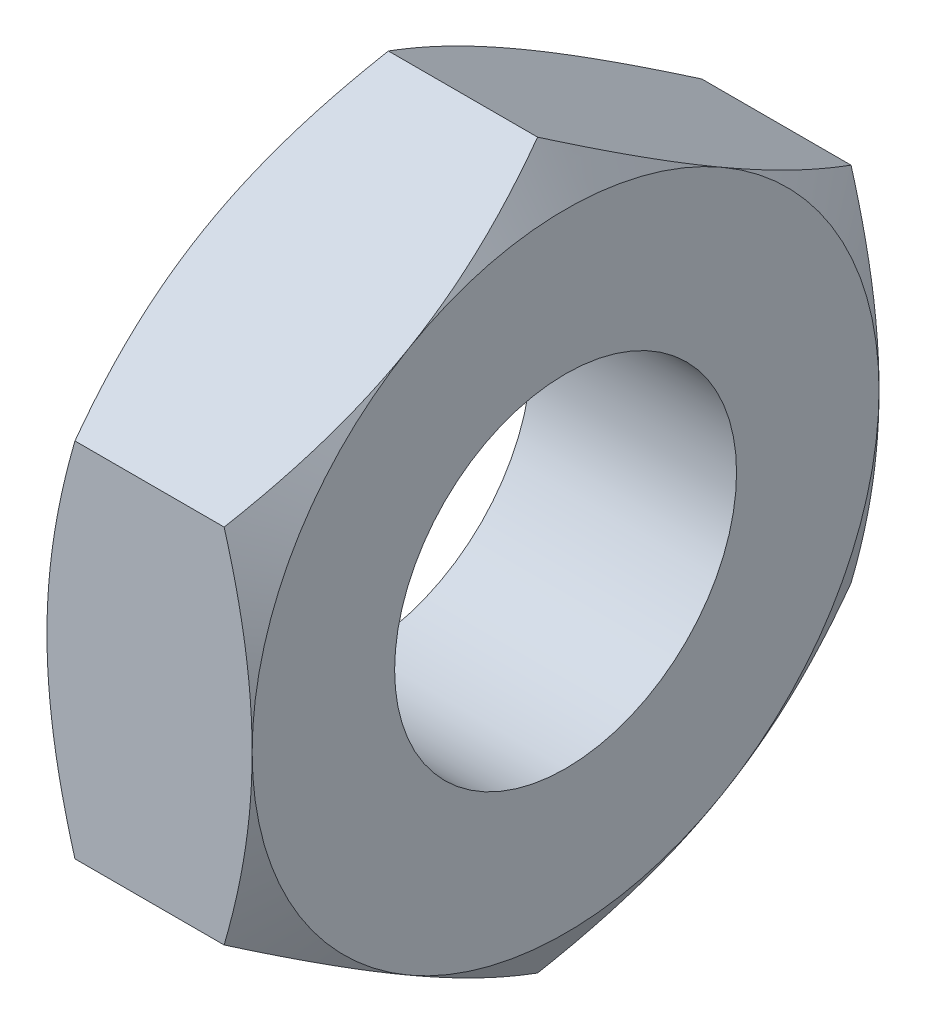
ISO-10303-21;
HEADER;
FILE_DESCRIPTION(('STEP AP214'),'2;1');
FILE_NAME('part.step','',(''),(''),'','','');
FILE_SCHEMA(('AUTOMOTIVE_DESIGN { 1 0 10303 214 1 1 1 1 }'));
ENDSEC;
DATA;
#1=APPLICATION_CONTEXT('core data for automotive mechanical design processes');
#2=APPLICATION_PROTOCOL_DEFINITION('international standard','automotive_design',2000,#1);
#3=PRODUCT_CONTEXT('',#1,'mechanical');
#4=PRODUCT('Part','Part','',(#3));
#5=PRODUCT_RELATED_PRODUCT_CATEGORY('part','',(#4));
#6=PRODUCT_DEFINITION_FORMATION('','',#4);
#7=PRODUCT_DEFINITION_CONTEXT('part definition',#1,'design');
#8=PRODUCT_DEFINITION('design','',#6,#7);
#9=PRODUCT_DEFINITION_SHAPE('','',#8);
#10=(LENGTH_UNIT() NAMED_UNIT(*) SI_UNIT(.MILLI.,.METRE.));
#11=(NAMED_UNIT(*) PLANE_ANGLE_UNIT() SI_UNIT($,.RADIAN.));
#12=(NAMED_UNIT(*) SI_UNIT($,.STERADIAN.) SOLID_ANGLE_UNIT());
#13=UNCERTAINTY_MEASURE_WITH_UNIT(LENGTH_MEASURE(1.E-05),#10,'distance_accuracy_value','');
#14=(GEOMETRIC_REPRESENTATION_CONTEXT(3) GLOBAL_UNCERTAINTY_ASSIGNED_CONTEXT((#13)) GLOBAL_UNIT_ASSIGNED_CONTEXT((#10,
#11,#12)) REPRESENTATION_CONTEXT('',''));
#15=CARTESIAN_POINT('',(0.,0.,0.));
#16=DIRECTION('',(0.,0.,1.));
#17=DIRECTION('',(1.,0.,0.));
#18=AXIS2_PLACEMENT_3D('',#15,#16,#17);
#19=CARTESIAN_POINT('',(-2.4,1.58771324027147,-2.75));
#20=DIRECTION('',(0.,0.866025403784439,-0.5));
#21=DIRECTION('',(0.,0.5,0.866025403784439));
#22=AXIS2_PLACEMENT_3D('',#19,#20,#21);
#23=PLANE('',#22);
#24=DIRECTION('',(1.,0.,0.));
#25=VECTOR('',#24,1.);
#26=CARTESIAN_POINT('',(-2.4,3.17542648054294,0.));
#27=LINE('',#26,#25);
#28=CARTESIAN_POINT('',(-1.55437990693814,3.17542648054294,0.));
#29=VERTEX_POINT('',#28);
#30=CARTESIAN_POINT('',(-0.245620093061856,3.17542648054294,0.));
#31=VERTEX_POINT('',#30);
#32=EDGE_CURVE('E274',#29,#31,#27,.T.);
#33=ORIENTED_EDGE('',*,*,#32,.T.);
#34=CARTESIAN_POINT('',(-0.245686763364754,3.17554195059677,0.000199999999999338));
#35=CARTESIAN_POINT('',(-0.205387662249257,3.10576962051742,-0.120649220659907));
#36=CARTESIAN_POINT('',(-0.168736902597657,3.03539502097908,-0.242541602622634));
#37=CARTESIAN_POINT('',(-0.104762182969796,2.89342717394438,-0.488437126727892));
#38=CARTESIAN_POINT('',(-0.0774608556744934,2.82183140359858,-0.612444638573854));
#39=CARTESIAN_POINT('',(-0.0349617452941134,2.67952717191842,-0.858922797975942));
#40=CARTESIAN_POINT('',(-0.0194811186224546,2.60884060771577,-0.981355518587415));
#41=CARTESIAN_POINT('',(-0.000999397369937409,2.46713482015518,-1.22679714236891));
#42=CARTESIAN_POINT('',(0.00201700053740334,2.39611611197037,-1.34980515323291));
#43=CARTESIAN_POINT('',(-0.00425314542854351,2.26341005486544,-1.57965878661079));
#44=CARTESIAN_POINT('',(-0.0120001542766991,2.20170285541368,-1.68653879125402));
#45=CARTESIAN_POINT('',(-0.0365551810643515,2.07869048467394,-1.89960246733475));
#46=CARTESIAN_POINT('',(-0.053371589650567,2.01738573896433,-2.00578540164889));
#47=CARTESIAN_POINT('',(-0.0954119223459529,1.89411967378234,-2.21928848939318));
#48=CARTESIAN_POINT('',(-0.120814080687227,1.83217395817122,-2.32658161614285));
#49=CARTESIAN_POINT('',(-0.178467225839978,1.70920651275307,-2.53956747928405));
#50=CARTESIAN_POINT('',(-0.210704663298978,1.64818320715446,-2.64526294502665));
#51=CARTESIAN_POINT('',(-0.245686763364756,1.58759777021763,-2.7502));
#52=B_SPLINE_CURVE_WITH_KNOTS('',3,(#34,#35,#36,#37,#38,#39,#40,#41,#42,#43,#44,#45,#46,#47,#48,
#49,#50,#51),.UNSPECIFIED.,.F.,.F.,(4,2,2,2,2,2,2,2,4),(0.,0.435912828725887,0.872873557116329,
1.29901931904671,1.72464171213573,2.09526089052937,2.46622354066374,2.84541551798557,
3.22386274754524),.UNSPECIFIED.);
#53=CARTESIAN_POINT('',(0.,2.38156986040721,-1.375));
#54=VERTEX_POINT('',#53);
#55=EDGE_CURVE('E66',#31,#54,#52,.T.);
#56=ORIENTED_EDGE('',*,*,#55,.T.);
#57=CARTESIAN_POINT('',(-0.245620093061856,1.58771324027146,-2.75));
#58=VERTEX_POINT('',#57);
#59=EDGE_CURVE('E224',#54,#58,#52,.T.);
#60=ORIENTED_EDGE('',*,*,#59,.T.);
#61=DIRECTION('',(1.,0.,0.));
#62=VECTOR('',#61,1.);
#63=CARTESIAN_POINT('',(-2.4,1.58771324027147,-2.75));
#64=LINE('',#63,#62);
#65=CARTESIAN_POINT('',(-1.55437990693814,1.58771324027146,-2.75));
#66=VERTEX_POINT('',#65);
#67=EDGE_CURVE('E262',#66,#58,#64,.T.);
#68=ORIENTED_EDGE('',*,*,#67,.F.);
#69=CARTESIAN_POINT('',(-1.55431323663524,1.58759777021763,-2.7502));
#70=CARTESIAN_POINT('',(-1.59461233775074,1.65737010029698,-2.62935077934009));
#71=CARTESIAN_POINT('',(-1.63126309740234,1.72774469983533,-2.50745839737737));
#72=CARTESIAN_POINT('',(-1.6952378170302,1.86971254687002,-2.26156287327211));
#73=CARTESIAN_POINT('',(-1.72253914432551,1.94130831721582,-2.13755536142615));
#74=CARTESIAN_POINT('',(-1.76503825470589,2.08361254889598,-1.89107720202406));
#75=CARTESIAN_POINT('',(-1.78051888137754,2.15429911309863,-1.76864448141258));
#76=CARTESIAN_POINT('',(-1.79900060263006,2.29600490065922,-1.52320285763109));
#77=CARTESIAN_POINT('',(-1.8020170005374,2.36702360884403,-1.40019484676709));
#78=CARTESIAN_POINT('',(-1.79574685457146,2.49972966594896,-1.17034121338921));
#79=CARTESIAN_POINT('',(-1.7879998457233,2.56143686540072,-1.06346120874598));
#80=CARTESIAN_POINT('',(-1.76344481893565,2.68444923614046,-0.850397532665252));
#81=CARTESIAN_POINT('',(-1.74662841034943,2.74575398185007,-0.744214598351113));
#82=CARTESIAN_POINT('',(-1.70458807765405,2.86902004703206,-0.530711510606818));
#83=CARTESIAN_POINT('',(-1.67918591931277,2.93096576264318,-0.423418383857146));
#84=CARTESIAN_POINT('',(-1.62153277416002,3.05393320806133,-0.21043252071595));
#85=CARTESIAN_POINT('',(-1.58929533670102,3.11495651365995,-0.104737054973348));
#86=CARTESIAN_POINT('',(-1.55431323663525,3.17554195059677,0.000199999999999326));
#87=B_SPLINE_CURVE_WITH_KNOTS('',3,(#69,#70,#71,#72,#73,#74,#75,#76,#77,#78,#79,#80,#81,#82,#83,
#84,#85,#86),.UNSPECIFIED.,.F.,.F.,(4,2,2,2,2,2,2,2,4),(0.,0.435912828725887,0.87287355711633,
1.29901931904671,1.72464171213573,2.09526089052937,2.46622354066374,2.84541551798557,
3.22386274754524),.UNSPECIFIED.);
#88=CARTESIAN_POINT('',(-1.8,2.38156986040721,-1.375));
#89=VERTEX_POINT('',#88);
#90=EDGE_CURVE('E308',#66,#89,#87,.T.);
#91=ORIENTED_EDGE('',*,*,#90,.T.);
#92=EDGE_CURVE('E340',#89,#29,#87,.T.);
#93=ORIENTED_EDGE('',*,*,#92,.T.);
#94=EDGE_LOOP('',(#33,#56,#60,#68,#91,#93));
#95=FACE_BOUND('',#94,.T.);
#96=ADVANCED_FACE('F50',(#95),#23,.T.);
#97=CARTESIAN_POINT('',(-2.4,-1.58771324027148,-2.75));
#98=DIRECTION('',(0.,0.,-1.));
#99=DIRECTION('',(-1.,0.,0.));
#100=AXIS2_PLACEMENT_3D('',#97,#98,#99);
#101=PLANE('',#100);
#102=ORIENTED_EDGE('',*,*,#67,.T.);
#103=CARTESIAN_POINT('',(-1.31594843960292,-4.21084949309676,-2.75));
#104=CARTESIAN_POINT('',(-1.25759993615223,-4.0901089421409,-2.75));
#105=CARTESIAN_POINT('',(-1.19983146511757,-3.9690829206551,-2.75));
#106=CARTESIAN_POINT('',(-1.08578603842304,-3.72630558284844,-2.75));
#107=CARTESIAN_POINT('',(-1.02950934100246,-3.60455414536201,-2.75));
#108=CARTESIAN_POINT('',(-0.918482443352746,-3.35951393034355,-2.75));
#109=CARTESIAN_POINT('',(-0.863742821605827,-3.23622034236437,-2.75));
#110=CARTESIAN_POINT('',(-0.756614777476445,-2.98861980138744,-2.75));
#111=CARTESIAN_POINT('',(-0.704226232536755,-2.86431290161182,-2.75));
#112=CARTESIAN_POINT('',(-0.601803572146116,-2.61294485887172,-2.75));
#113=CARTESIAN_POINT('',(-0.551806257898387,-2.48586863815655,-2.75));
#114=CARTESIAN_POINT('',(-0.455727408784596,-2.23021732171541,-2.75));
#115=CARTESIAN_POINT('',(-0.409646309576967,-2.10164206103364,-2.75));
#116=CARTESIAN_POINT('',(-0.322638077046228,-1.84305218799468,-2.75));
#117=CARTESIAN_POINT('',(-0.281699986413885,-1.71304130052584,-2.75));
#118=CARTESIAN_POINT('',(-0.206307307624346,-1.45117125062148,-2.75));
#119=CARTESIAN_POINT('',(-0.171850669152766,-1.31931268690203,-2.75));
#120=CARTESIAN_POINT('',(-0.111093671530903,-1.05365722480013,-2.75));
#121=CARTESIAN_POINT('',(-0.0847954840951209,-0.919859820217597,-2.75));
#122=CARTESIAN_POINT('',(-0.0421260371966111,-0.650651874037387,-2.75));
#123=CARTESIAN_POINT('',(-0.0257547865105431,-0.515241331013601,-2.75));
#124=CARTESIAN_POINT('',(-0.00438749654023752,-0.244373242869217,-2.75));
#125=CARTESIAN_POINT('',(0.000680556773215944,-0.10892152637714,-2.75));
#126=CARTESIAN_POINT('',(-0.000827795632671624,0.161887058855127,-2.75));
#127=CARTESIAN_POINT('',(-0.00740117868555301,0.297243943089634,-2.75));
#128=CARTESIAN_POINT('',(-0.0281041300468427,0.528385436717537,-2.75));
#129=CARTESIAN_POINT('',(-0.0395376410301871,0.624425050137497,-2.75));
#130=CARTESIAN_POINT('',(-0.0675217196133498,0.815762399811543,-2.75));
#131=CARTESIAN_POINT('',(-0.084073094227681,0.911060016631967,-2.75));
#132=CARTESIAN_POINT('',(-0.140535361278283,1.19576218748917,-2.75));
#133=CARTESIAN_POINT('',(-0.187239859417293,1.38383224738498,-2.75));
#134=CARTESIAN_POINT('',(-0.267792497030578,1.66525048947487,-2.75));
#135=CARTESIAN_POINT('',(-0.296803334995501,1.76006556248559,-2.75));
#136=CARTESIAN_POINT('',(-0.357695648906588,1.94870609382217,-2.75));
#137=CARTESIAN_POINT('',(-0.389575144878504,2.04253218553698,-2.75));
#138=CARTESIAN_POINT('',(-0.45554141818645,2.22880240354987,-2.75));
#139=CARTESIAN_POINT('',(-0.489614761455534,2.32125133588454,-2.75));
#140=CARTESIAN_POINT('',(-0.559761368231111,2.50543192042631,-2.75));
#141=CARTESIAN_POINT('',(-0.59583544003732,2.59716326539582,-2.75));
#142=CARTESIAN_POINT('',(-0.632712441997487,2.68856293053349,-2.75));
#143=B_SPLINE_CURVE_WITH_KNOTS('',3,(#103,#104,#105,#106,#107,#108,#109,#110,#111,#112,#113,
#114,#115,#116,#117,#118,#119,#120,#121,#122,#123,#124,#125,#126,#127,#128,#129,#130,#131,#132,
#133,#134,#135,#136,#137,#138,#139,#140,#141,#142),.UNSPECIFIED.,.F.,.F.,(4,2,2,2,2,2,2,2,2,2,2,
2,2,2,2,2,2,2,2,4),(0.,0.402305607365936,0.804680408536996,1.20935783819118,1.61401414820818,
2.0236383818577,2.43330812457348,2.842089694796,3.25074173456636,3.65950246109143,
4.06826354901183,4.47441284024649,4.88045669141171,5.17046846817546,5.46052599902452,
6.04107275309884,6.33851131304663,6.63574613017457,6.93130791005795,7.22698998004826),.UNSPECIFIED.);
#144=CARTESIAN_POINT('',(0.,0.,-2.75));
#145=VERTEX_POINT('',#144);
#146=EDGE_CURVE('E218',#58,#145,#143,.F.);
#147=ORIENTED_EDGE('',*,*,#146,.T.);
#148=CARTESIAN_POINT('',(-0.245620093061856,-1.58771324027149,-2.74999999999998));
#149=VERTEX_POINT('',#148);
#150=EDGE_CURVE('E212',#145,#149,#143,.F.);
#151=ORIENTED_EDGE('',*,*,#150,.T.);
#152=DIRECTION('',(1.,0.,0.));
#153=VECTOR('',#152,1.);
#154=CARTESIAN_POINT('',(-2.4,-1.58771324027148,-2.75));
#155=LINE('',#154,#153);
#156=CARTESIAN_POINT('',(-1.55437990693814,-1.58771324027149,-2.74999999999998));
#157=VERTEX_POINT('',#156);
#158=EDGE_CURVE('E263',#157,#149,#155,.T.);
#159=ORIENTED_EDGE('',*,*,#158,.F.);
#160=CARTESIAN_POINT('',(-0.484051560397077,-4.21084949309676,-2.75));
#161=CARTESIAN_POINT('',(-0.542400063847774,-4.0901089421409,-2.75));
#162=CARTESIAN_POINT('',(-0.60016853488243,-3.9690829206551,-2.75));
#163=CARTESIAN_POINT('',(-0.714213961576964,-3.72630558284844,-2.75));
#164=CARTESIAN_POINT('',(-0.770490658997542,-3.60455414536201,-2.75));
#165=CARTESIAN_POINT('',(-0.881517556647254,-3.35951393034355,-2.75));
#166=CARTESIAN_POINT('',(-0.936257178394173,-3.23622034236437,-2.75));
#167=CARTESIAN_POINT('',(-1.04338522252356,-2.98861980138744,-2.75));
#168=CARTESIAN_POINT('',(-1.09577376746325,-2.86431290161182,-2.75));
#169=CARTESIAN_POINT('',(-1.19819642785388,-2.61294485887172,-2.75));
#170=CARTESIAN_POINT('',(-1.24819374210161,-2.48586863815655,-2.75));
#171=CARTESIAN_POINT('',(-1.3442725912154,-2.23021732171541,-2.75));
#172=CARTESIAN_POINT('',(-1.39035369042303,-2.10164206103364,-2.75));
#173=CARTESIAN_POINT('',(-1.47736192295377,-1.84305218799468,-2.75));
#174=CARTESIAN_POINT('',(-1.51830001358612,-1.71304130052584,-2.75));
#175=CARTESIAN_POINT('',(-1.59369269237565,-1.45117125062148,-2.75));
#176=CARTESIAN_POINT('',(-1.62814933084723,-1.31931268690203,-2.75));
#177=CARTESIAN_POINT('',(-1.6889063284691,-1.05365722480013,-2.75));
#178=CARTESIAN_POINT('',(-1.71520451590488,-0.919859820217597,-2.75));
#179=CARTESIAN_POINT('',(-1.75787396280339,-0.650651874037387,-2.75));
#180=CARTESIAN_POINT('',(-1.77424521348946,-0.515241331013601,-2.75));
#181=CARTESIAN_POINT('',(-1.79561250345976,-0.244373242869217,-2.75));
#182=CARTESIAN_POINT('',(-1.80068055677322,-0.10892152637714,-2.75));
#183=CARTESIAN_POINT('',(-1.79917220436733,0.161887058855127,-2.75));
#184=CARTESIAN_POINT('',(-1.79259882131445,0.297243943089633,-2.75));
#185=CARTESIAN_POINT('',(-1.77189586995316,0.528385436717537,-2.75));
#186=CARTESIAN_POINT('',(-1.76046235896981,0.624425050137496,-2.75));
#187=CARTESIAN_POINT('',(-1.73247828038665,0.815762399811543,-2.75));
#188=CARTESIAN_POINT('',(-1.71592690577232,0.911060016631967,-2.75));
#189=CARTESIAN_POINT('',(-1.65946463872172,1.19576218748917,-2.75));
#190=CARTESIAN_POINT('',(-1.61276014058271,1.38383224738498,-2.75));
#191=CARTESIAN_POINT('',(-1.53220750296942,1.66525048947487,-2.75));
#192=CARTESIAN_POINT('',(-1.5031966650045,1.7600655624856,-2.75));
#193=CARTESIAN_POINT('',(-1.44230435109341,1.94870609382217,-2.75));
#194=CARTESIAN_POINT('',(-1.4104248551215,2.04253218553698,-2.75));
#195=CARTESIAN_POINT('',(-1.34445858181355,2.22880240354987,-2.75));
#196=CARTESIAN_POINT('',(-1.31038523854447,2.32125133588454,-2.75));
#197=CARTESIAN_POINT('',(-1.24023863176889,2.50543192042631,-2.75));
#198=CARTESIAN_POINT('',(-1.20416455996268,2.59716326539582,-2.75));
#199=CARTESIAN_POINT('',(-1.16728755800251,2.68856293053349,-2.75));
#200=B_SPLINE_CURVE_WITH_KNOTS('',3,(#160,#161,#162,#163,#164,#165,#166,#167,#168,#169,#170,
#171,#172,#173,#174,#175,#176,#177,#178,#179,#180,#181,#182,#183,#184,#185,#186,#187,#188,#189,
#190,#191,#192,#193,#194,#195,#196,#197,#198,#199),.UNSPECIFIED.,.F.,.F.,(4,2,2,2,2,2,2,2,2,2,2,
2,2,2,2,2,2,2,2,4),(0.,0.402305607365936,0.804680408536996,1.20935783819118,1.61401414820818,
2.0236383818577,2.43330812457348,2.842089694796,3.25074173456636,3.65950246109143,
4.06826354901183,4.4744128402465,4.88045669141171,5.17046846817546,5.46052599902452,
6.04107275309884,6.33851131304663,6.63574613017457,6.93130791005795,7.22698998004826),.UNSPECIFIED.);
#201=CARTESIAN_POINT('',(-1.8,0.,-2.75));
#202=VERTEX_POINT('',#201);
#203=EDGE_CURVE('E244',#157,#202,#200,.T.);
#204=ORIENTED_EDGE('',*,*,#203,.T.);
#205=EDGE_CURVE('E240',#202,#66,#200,.T.);
#206=ORIENTED_EDGE('',*,*,#205,.T.);
#207=EDGE_LOOP('',(#102,#147,#151,#159,#204,#206));
#208=FACE_BOUND('',#207,.T.);
#209=ADVANCED_FACE('F226',(#208),#101,.T.);
#210=CARTESIAN_POINT('',(-2.4,-3.17542648054295,0.));
#211=DIRECTION('',(0.,-0.866025403784439,-0.5));
#212=DIRECTION('',(0.,0.5,-0.866025403784439));
#213=AXIS2_PLACEMENT_3D('',#210,#211,#212);
#214=PLANE('',#213);
#215=ORIENTED_EDGE('',*,*,#158,.T.);
#216=CARTESIAN_POINT('',(-0.24568676336476,-1.58759777021764,-2.7502));
#217=CARTESIAN_POINT('',(-0.205387662249263,-1.65737010029699,-2.62935077934009));
#218=CARTESIAN_POINT('',(-0.168736902597663,-1.72774469983534,-2.50745839737737));
#219=CARTESIAN_POINT('',(-0.104762182969802,-1.86971254687004,-2.26156287327211));
#220=CARTESIAN_POINT('',(-0.0774608556744992,-1.94130831721584,-2.13755536142614));
#221=CARTESIAN_POINT('',(-0.0349617452941194,-2.083612548896,-1.89107720202406));
#222=CARTESIAN_POINT('',(-0.0194811186224607,-2.15429911309865,-1.76864448141258));
#223=CARTESIAN_POINT('',(-0.000999397369943872,-2.29600490065924,-1.52320285763108));
#224=CARTESIAN_POINT('',(0.00201700053739673,-2.36702360884405,-1.40019484676709));
#225=CARTESIAN_POINT('',(-0.00425314542855044,-2.49972966594898,-1.17034121338921));
#226=CARTESIAN_POINT('',(-0.0120001542767062,-2.56143686540073,-1.06346120874598));
#227=CARTESIAN_POINT('',(-0.0365551810643585,-2.68444923614047,-0.850397532665249));
#228=CARTESIAN_POINT('',(-0.0533715896505738,-2.74575398185009,-0.74421459835111));
#229=CARTESIAN_POINT('',(-0.0954119223459594,-2.86902004703207,-0.530711510606816));
#230=CARTESIAN_POINT('',(-0.120814080687233,-2.93096576264319,-0.423418383857145));
#231=CARTESIAN_POINT('',(-0.178467225839984,-3.05393320806134,-0.210432520715949));
#232=CARTESIAN_POINT('',(-0.210704663298984,-3.11495651365996,-0.104737054973348));
#233=CARTESIAN_POINT('',(-0.245686763364761,-3.17554195059679,0.000199999999999745));
#234=B_SPLINE_CURVE_WITH_KNOTS('',3,(#216,#217,#218,#219,#220,#221,#222,#223,#224,#225,#226,
#227,#228,#229,#230,#231,#232,#233),.UNSPECIFIED.,.F.,.F.,(4,2,2,2,2,2,2,2,4),(0.,
0.435912828725888,0.872873557116332,1.29901931904672,1.72464171213574,2.09526089052938,
2.46622354066374,2.84541551798557,3.22386274754524),.UNSPECIFIED.);
#235=CARTESIAN_POINT('',(0.,-2.38156986040721,-1.375));
#236=VERTEX_POINT('',#235);
#237=EDGE_CURVE('E223',#149,#236,#234,.T.);
#238=ORIENTED_EDGE('',*,*,#237,.T.);
#239=CARTESIAN_POINT('',(-0.245620093061856,-3.17542648054294,0.));
#240=VERTEX_POINT('',#239);
#241=EDGE_CURVE('E207',#236,#240,#234,.T.);
#242=ORIENTED_EDGE('',*,*,#241,.T.);
#243=DIRECTION('',(1.,0.,0.));
#244=VECTOR('',#243,1.);
#245=CARTESIAN_POINT('',(-2.4,-3.17542648054295,0.));
#246=LINE('',#245,#244);
#247=CARTESIAN_POINT('',(-1.55437990693814,-3.17542648054294,0.));
#248=VERTEX_POINT('',#247);
#249=EDGE_CURVE('E269',#248,#240,#246,.T.);
#250=ORIENTED_EDGE('',*,*,#249,.F.);
#251=CARTESIAN_POINT('',(-1.55431323663524,-3.17554195059679,0.000199999999999892));
#252=CARTESIAN_POINT('',(-1.59461233775074,-3.10576962051743,-0.120649220659906));
#253=CARTESIAN_POINT('',(-1.63126309740234,-3.03539502097909,-0.242541602622634));
#254=CARTESIAN_POINT('',(-1.6952378170302,-2.89342717394439,-0.488437126727894));
#255=CARTESIAN_POINT('',(-1.7225391443255,-2.82183140359859,-0.612444638573857));
#256=CARTESIAN_POINT('',(-1.76503825470588,-2.67952717191843,-0.858922797975945));
#257=CARTESIAN_POINT('',(-1.78051888137754,-2.60884060771578,-0.981355518587419));
#258=CARTESIAN_POINT('',(-1.79900060263006,-2.46713482015519,-1.22679714236892));
#259=CARTESIAN_POINT('',(-1.8020170005374,-2.39611611197038,-1.34980515323291));
#260=CARTESIAN_POINT('',(-1.79574685457145,-2.26341005486545,-1.5796587866108));
#261=CARTESIAN_POINT('',(-1.78799984572329,-2.20170285541369,-1.68653879125402));
#262=CARTESIAN_POINT('',(-1.76344481893564,-2.07869048467395,-1.89960246733475));
#263=CARTESIAN_POINT('',(-1.74662841034943,-2.01738573896434,-2.00578540164889));
#264=CARTESIAN_POINT('',(-1.70458807765404,-1.89411967378236,-2.21928848939318));
#265=CARTESIAN_POINT('',(-1.67918591931277,-1.83217395817124,-2.32658161614285));
#266=CARTESIAN_POINT('',(-1.62153277416002,-1.70920651275308,-2.53956747928405));
#267=CARTESIAN_POINT('',(-1.58929533670102,-1.64818320715447,-2.64526294502665));
#268=CARTESIAN_POINT('',(-1.55431323663524,-1.58759777021764,-2.7502));
#269=B_SPLINE_CURVE_WITH_KNOTS('',3,(#251,#252,#253,#254,#255,#256,#257,#258,#259,#260,#261,
#262,#263,#264,#265,#266,#267,#268),.UNSPECIFIED.,.F.,.F.,(4,2,2,2,2,2,2,2,4),(0.,
0.435912828725889,0.872873557116333,1.29901931904672,1.72464171213574,2.09526089052938,
2.46622354066374,2.84541551798557,3.22386274754524),.UNSPECIFIED.);
#270=CARTESIAN_POINT('',(-1.8,-2.38156986040721,-1.375));
#271=VERTEX_POINT('',#270);
#272=EDGE_CURVE('E258',#248,#271,#269,.T.);
#273=ORIENTED_EDGE('',*,*,#272,.T.);
#274=EDGE_CURVE('E255',#271,#157,#269,.T.);
#275=ORIENTED_EDGE('',*,*,#274,.T.);
#276=EDGE_LOOP('',(#215,#238,#242,#250,#273,#275));
#277=FACE_BOUND('',#276,.T.);
#278=ADVANCED_FACE('F235',(#277),#214,.T.);
#279=CARTESIAN_POINT('',(-2.4,-1.58771324027148,2.75));
#280=DIRECTION('',(0.,-0.866025403784439,0.5));
#281=DIRECTION('',(0.,-0.5,-0.866025403784439));
#282=AXIS2_PLACEMENT_3D('',#279,#280,#281);
#283=PLANE('',#282);
#284=ORIENTED_EDGE('',*,*,#249,.T.);
#285=CARTESIAN_POINT('',(-0.245686763364761,-3.17554195059679,-0.000200000000000168));
#286=CARTESIAN_POINT('',(-0.205387662249264,-3.10576962051743,0.120649220659906));
#287=CARTESIAN_POINT('',(-0.168736902597664,-3.03539502097909,0.242541602622634));
#288=CARTESIAN_POINT('',(-0.104762182969803,-2.89342717394439,0.488437126727893));
#289=CARTESIAN_POINT('',(-0.0774608556744999,-2.82183140359859,0.612444638573856));
#290=CARTESIAN_POINT('',(-0.0349617452941198,-2.67952717191843,0.858922797975945));
#291=CARTESIAN_POINT('',(-0.0194811186224609,-2.60884060771578,0.981355518587418));
#292=CARTESIAN_POINT('',(-0.000999397369943836,-2.46713482015519,1.22679714236892));
#293=CARTESIAN_POINT('',(0.00201700053739685,-2.39611611197038,1.34980515323291));
#294=CARTESIAN_POINT('',(-0.00425314542854986,-2.26341005486545,1.57965878661079));
#295=CARTESIAN_POINT('',(-0.0120001542767052,-2.20170285541369,1.68653879125402));
#296=CARTESIAN_POINT('',(-0.0365551810643572,-2.07869048467395,1.89960246733475));
#297=CARTESIAN_POINT('',(-0.0533715896505725,-2.01738573896434,2.00578540164889));
#298=CARTESIAN_POINT('',(-0.0954119223459579,-1.89411967378236,2.21928848939318));
#299=CARTESIAN_POINT('',(-0.120814080687232,-1.83217395817124,2.32658161614286));
#300=CARTESIAN_POINT('',(-0.178467225839982,-1.70920651275308,2.53956747928405));
#301=CARTESIAN_POINT('',(-0.210704663298982,-1.64818320715447,2.64526294502665));
#302=CARTESIAN_POINT('',(-0.245686763364759,-1.58759777021764,2.7502));
#303=B_SPLINE_CURVE_WITH_KNOTS('',3,(#285,#286,#287,#288,#289,#290,#291,#292,#293,#294,#295,
#296,#297,#298,#299,#300,#301,#302),.UNSPECIFIED.,.F.,.F.,(4,2,2,2,2,2,2,2,4),(0.,
0.435912828725889,0.872873557116333,1.29901931904672,1.72464171213574,2.09526089052938,
2.46622354066374,2.84541551798557,3.22386274754524),.UNSPECIFIED.);
#304=CARTESIAN_POINT('',(0.,-2.38156986040721,1.375));
#305=VERTEX_POINT('',#304);
#306=EDGE_CURVE('E171',#240,#305,#303,.T.);
#307=ORIENTED_EDGE('',*,*,#306,.T.);
#308=CARTESIAN_POINT('',(-0.245620093061856,-1.58771324027146,2.75));
#309=VERTEX_POINT('',#308);
#310=EDGE_CURVE('E153',#305,#309,#303,.T.);
#311=ORIENTED_EDGE('',*,*,#310,.T.);
#312=DIRECTION('',(1.,0.,0.));
#313=VECTOR('',#312,1.);
#314=CARTESIAN_POINT('',(-2.4,-1.58771324027148,2.75));
#315=LINE('',#314,#313);
#316=CARTESIAN_POINT('',(-1.55437990693814,-1.58771324027146,2.75));
#317=VERTEX_POINT('',#316);
#318=EDGE_CURVE('E167',#317,#309,#315,.T.);
#319=ORIENTED_EDGE('',*,*,#318,.F.);
#320=CARTESIAN_POINT('',(-1.55431323663524,-1.58759777021764,2.7502));
#321=CARTESIAN_POINT('',(-1.59461233775074,-1.65737010029699,2.62935077934009));
#322=CARTESIAN_POINT('',(-1.63126309740234,-1.72774469983534,2.50745839737737));
#323=CARTESIAN_POINT('',(-1.6952378170302,-1.86971254687003,2.26156287327211));
#324=CARTESIAN_POINT('',(-1.7225391443255,-1.94130831721584,2.13755536142614));
#325=CARTESIAN_POINT('',(-1.76503825470588,-2.083612548896,1.89107720202406));
#326=CARTESIAN_POINT('',(-1.78051888137754,-2.15429911309865,1.76864448141258));
#327=CARTESIAN_POINT('',(-1.79900060263006,-2.29600490065923,1.52320285763108));
#328=CARTESIAN_POINT('',(-1.8020170005374,-2.36702360884404,1.40019484676709));
#329=CARTESIAN_POINT('',(-1.79574685457145,-2.49972966594898,1.17034121338921));
#330=CARTESIAN_POINT('',(-1.78799984572329,-2.56143686540073,1.06346120874598));
#331=CARTESIAN_POINT('',(-1.76344481893564,-2.68444923614047,0.85039753266525));
#332=CARTESIAN_POINT('',(-1.74662841034943,-2.74575398185009,0.74421459835111));
#333=CARTESIAN_POINT('',(-1.70458807765404,-2.86902004703207,0.530711510606816));
#334=CARTESIAN_POINT('',(-1.67918591931277,-2.93096576264319,0.423418383857145));
#335=CARTESIAN_POINT('',(-1.62153277416002,-3.05393320806134,0.210432520715949));
#336=CARTESIAN_POINT('',(-1.58929533670102,-3.11495651365996,0.104737054973348));
#337=CARTESIAN_POINT('',(-1.55431323663524,-3.17554195059679,-0.000200000000000299));
#338=B_SPLINE_CURVE_WITH_KNOTS('',3,(#320,#321,#322,#323,#324,#325,#326,#327,#328,#329,#330,
#331,#332,#333,#334,#335,#336,#337),.UNSPECIFIED.,.F.,.F.,(4,2,2,2,2,2,2,2,4),(0.,
0.435912828725888,0.872873557116332,1.29901931904671,1.72464171213574,2.09526089052937,
2.46622354066374,2.84541551798557,3.22386274754524),.UNSPECIFIED.);
#339=CARTESIAN_POINT('',(-1.8,-2.38156986040721,1.375));
#340=VERTEX_POINT('',#339);
#341=EDGE_CURVE('E246',#317,#340,#338,.T.);
#342=ORIENTED_EDGE('',*,*,#341,.T.);
#343=EDGE_CURVE('E259',#340,#248,#338,.T.);
#344=ORIENTED_EDGE('',*,*,#343,.T.);
#345=EDGE_LOOP('',(#284,#307,#311,#319,#342,#344));
#346=FACE_BOUND('',#345,.T.);
#347=ADVANCED_FACE('F306',(#346),#283,.T.);
#348=CARTESIAN_POINT('',(-2.4,1.58771324027147,2.75));
#349=DIRECTION('',(0.,0.,1.));
#350=DIRECTION('',(1.,0.,0.));
#351=AXIS2_PLACEMENT_3D('',#348,#349,#350);
#352=PLANE('',#351);
#353=ORIENTED_EDGE('',*,*,#318,.T.);
#354=CARTESIAN_POINT('',(-1.31594843960292,-4.21084949309676,2.75));
#355=CARTESIAN_POINT('',(-1.25759993615223,-4.0901089421409,2.75));
#356=CARTESIAN_POINT('',(-1.19983146511757,-3.9690829206551,2.75));
#357=CARTESIAN_POINT('',(-1.08578603842304,-3.72630558284844,2.75));
#358=CARTESIAN_POINT('',(-1.02950934100246,-3.60455414536201,2.75));
#359=CARTESIAN_POINT('',(-0.918482443352746,-3.35951393034355,2.75));
#360=CARTESIAN_POINT('',(-0.863742821605827,-3.23622034236437,2.75));
#361=CARTESIAN_POINT('',(-0.756614777476445,-2.98861980138744,2.75));
#362=CARTESIAN_POINT('',(-0.704226232536755,-2.86431290161182,2.75));
#363=CARTESIAN_POINT('',(-0.601803572146116,-2.61294485887172,2.75));
#364=CARTESIAN_POINT('',(-0.551806257898387,-2.48586863815655,2.75));
#365=CARTESIAN_POINT('',(-0.455727408784596,-2.23021732171541,2.75));
#366=CARTESIAN_POINT('',(-0.409646309576967,-2.10164206103364,2.75));
#367=CARTESIAN_POINT('',(-0.322638077046227,-1.84305218799468,2.75));
#368=CARTESIAN_POINT('',(-0.281699986413885,-1.71304130052584,2.75));
#369=CARTESIAN_POINT('',(-0.206307307624346,-1.45117125062148,2.75));
#370=CARTESIAN_POINT('',(-0.171850669152765,-1.31931268690203,2.75));
#371=CARTESIAN_POINT('',(-0.111093671530903,-1.05365722480013,2.75));
#372=CARTESIAN_POINT('',(-0.0847954840951209,-0.919859820217596,2.75));
#373=CARTESIAN_POINT('',(-0.0421260371966112,-0.650651874037386,2.75));
#374=CARTESIAN_POINT('',(-0.0257547865105433,-0.5152413310136,2.75));
#375=CARTESIAN_POINT('',(-0.00438749654023777,-0.244373242869216,2.75));
#376=CARTESIAN_POINT('',(0.000680556773215723,-0.108921526377138,2.75));
#377=CARTESIAN_POINT('',(-0.000827795632671826,0.161887058855129,2.75));
#378=CARTESIAN_POINT('',(-0.00740117868555323,0.297243943089635,2.75));
#379=CARTESIAN_POINT('',(-0.0281041300468429,0.528385436717538,2.75));
#380=CARTESIAN_POINT('',(-0.0395376410301874,0.624425050137498,2.75));
#381=CARTESIAN_POINT('',(-0.0675217196133501,0.815762399811544,2.75));
#382=CARTESIAN_POINT('',(-0.0840730942276814,0.911060016631968,2.75));
#383=CARTESIAN_POINT('',(-0.140535361278284,1.19576218748917,2.75));
#384=CARTESIAN_POINT('',(-0.187239859417293,1.38383224738498,2.75));
#385=CARTESIAN_POINT('',(-0.267792497030579,1.66525048947487,2.75));
#386=CARTESIAN_POINT('',(-0.296803334995502,1.7600655624856,2.75));
#387=CARTESIAN_POINT('',(-0.357695648906589,1.94870609382217,2.75));
#388=CARTESIAN_POINT('',(-0.389575144878505,2.04253218553698,2.75));
#389=CARTESIAN_POINT('',(-0.45554141818645,2.22880240354987,2.75));
#390=CARTESIAN_POINT('',(-0.489614761455535,2.32125133588454,2.75));
#391=CARTESIAN_POINT('',(-0.559761368231112,2.50543192042631,2.75));
#392=CARTESIAN_POINT('',(-0.595835440037321,2.59716326539582,2.75));
#393=CARTESIAN_POINT('',(-0.632712441997488,2.68856293053349,2.75));
#394=B_SPLINE_CURVE_WITH_KNOTS('',3,(#354,#355,#356,#357,#358,#359,#360,#361,#362,#363,#364,
#365,#366,#367,#368,#369,#370,#371,#372,#373,#374,#375,#376,#377,#378,#379,#380,#381,#382,#383,
#384,#385,#386,#387,#388,#389,#390,#391,#392,#393),.UNSPECIFIED.,.F.,.F.,(4,2,2,2,2,2,2,2,2,2,2,
2,2,2,2,2,2,2,2,4),(0.,0.402305607365936,0.804680408536996,1.20935783819118,1.61401414820818,
2.0236383818577,2.43330812457348,2.842089694796,3.25074173456636,3.65950246109143,
4.06826354901183,4.47441284024649,4.88045669141171,5.17046846817546,5.46052599902452,
6.04107275309884,6.33851131304663,6.63574613017457,6.93130791005795,7.22698998004826),.UNSPECIFIED.);
#395=CARTESIAN_POINT('',(0.,0.,2.75));
#396=VERTEX_POINT('',#395);
#397=EDGE_CURVE('E147',#309,#396,#394,.T.);
#398=ORIENTED_EDGE('',*,*,#397,.T.);
#399=CARTESIAN_POINT('',(-0.245620093061856,1.58771324027147,2.74999999999999));
#400=VERTEX_POINT('',#399);
#401=EDGE_CURVE('E136',#396,#400,#394,.T.);
#402=ORIENTED_EDGE('',*,*,#401,.T.);
#403=DIRECTION('',(1.,0.,0.));
#404=VECTOR('',#403,1.);
#405=CARTESIAN_POINT('',(-2.4,1.58771324027147,2.75));
#406=LINE('',#405,#404);
#407=CARTESIAN_POINT('',(-1.55437990693814,1.58771324027147,2.75));
#408=VERTEX_POINT('',#407);
#409=EDGE_CURVE('E275',#408,#400,#406,.T.);
#410=ORIENTED_EDGE('',*,*,#409,.F.);
#411=CARTESIAN_POINT('',(-0.484051560397078,-4.21084949309676,2.75));
#412=CARTESIAN_POINT('',(-0.542400063847775,-4.0901089421409,2.75));
#413=CARTESIAN_POINT('',(-0.600168534882431,-3.9690829206551,2.75));
#414=CARTESIAN_POINT('',(-0.714213961576965,-3.72630558284844,2.75));
#415=CARTESIAN_POINT('',(-0.770490658997543,-3.60455414536201,2.75));
#416=CARTESIAN_POINT('',(-0.881517556647255,-3.35951393034355,2.75));
#417=CARTESIAN_POINT('',(-0.936257178394174,-3.23622034236437,2.75));
#418=CARTESIAN_POINT('',(-1.04338522252356,-2.98861980138744,2.75));
#419=CARTESIAN_POINT('',(-1.09577376746325,-2.86431290161182,2.75));
#420=CARTESIAN_POINT('',(-1.19819642785388,-2.61294485887172,2.75));
#421=CARTESIAN_POINT('',(-1.24819374210161,-2.48586863815654,2.75));
#422=CARTESIAN_POINT('',(-1.3442725912154,-2.23021732171541,2.75));
#423=CARTESIAN_POINT('',(-1.39035369042303,-2.10164206103364,2.75));
#424=CARTESIAN_POINT('',(-1.47736192295377,-1.84305218799468,2.75));
#425=CARTESIAN_POINT('',(-1.51830001358612,-1.71304130052584,2.75));
#426=CARTESIAN_POINT('',(-1.59369269237565,-1.45117125062148,2.75));
#427=CARTESIAN_POINT('',(-1.62814933084723,-1.31931268690203,2.75));
#428=CARTESIAN_POINT('',(-1.6889063284691,-1.05365722480013,2.75));
#429=CARTESIAN_POINT('',(-1.71520451590488,-0.919859820217596,2.75));
#430=CARTESIAN_POINT('',(-1.75787396280339,-0.650651874037386,2.75));
#431=CARTESIAN_POINT('',(-1.77424521348946,-0.515241331013599,2.75));
#432=CARTESIAN_POINT('',(-1.79561250345976,-0.244373242869216,2.75));
#433=CARTESIAN_POINT('',(-1.80068055677322,-0.108921526377138,2.75));
#434=CARTESIAN_POINT('',(-1.79917220436733,0.161887058855129,2.75));
#435=CARTESIAN_POINT('',(-1.79259882131445,0.297243943089635,2.75));
#436=CARTESIAN_POINT('',(-1.77189586995316,0.528385436717538,2.75));
#437=CARTESIAN_POINT('',(-1.76046235896981,0.624425050137498,2.75));
#438=CARTESIAN_POINT('',(-1.73247828038665,0.815762399811544,2.75));
#439=CARTESIAN_POINT('',(-1.71592690577232,0.911060016631968,2.75));
#440=CARTESIAN_POINT('',(-1.65946463872172,1.19576218748917,2.75));
#441=CARTESIAN_POINT('',(-1.61276014058271,1.38383224738498,2.75));
#442=CARTESIAN_POINT('',(-1.53220750296942,1.66525048947487,2.75));
#443=CARTESIAN_POINT('',(-1.5031966650045,1.7600655624856,2.75));
#444=CARTESIAN_POINT('',(-1.44230435109341,1.94870609382217,2.75));
#445=CARTESIAN_POINT('',(-1.41042485512149,2.04253218553698,2.75));
#446=CARTESIAN_POINT('',(-1.34445858181355,2.22880240354987,2.75));
#447=CARTESIAN_POINT('',(-1.31038523854446,2.32125133588454,2.75));
#448=CARTESIAN_POINT('',(-1.24023863176889,2.50543192042632,2.75));
#449=CARTESIAN_POINT('',(-1.20416455996268,2.59716326539582,2.75));
#450=CARTESIAN_POINT('',(-1.16728755800251,2.68856293053349,2.75));
#451=B_SPLINE_CURVE_WITH_KNOTS('',3,(#411,#412,#413,#414,#415,#416,#417,#418,#419,#420,#421,
#422,#423,#424,#425,#426,#427,#428,#429,#430,#431,#432,#433,#434,#435,#436,#437,#438,#439,#440,
#441,#442,#443,#444,#445,#446,#447,#448,#449,#450),.UNSPECIFIED.,.F.,.F.,(4,2,2,2,2,2,2,2,2,2,2,
2,2,2,2,2,2,2,2,4),(0.,0.402305607365936,0.804680408536996,1.20935783819118,1.61401414820818,
2.0236383818577,2.43330812457348,2.842089694796,3.25074173456636,3.65950246109143,
4.06826354901183,4.47441284024649,4.88045669141171,5.17046846817546,5.46052599902452,
6.04107275309884,6.33851131304663,6.63574613017457,6.93130791005795,7.22698998004826),.UNSPECIFIED.);
#452=CARTESIAN_POINT('',(-1.8,0.,2.75));
#453=VERTEX_POINT('',#452);
#454=EDGE_CURVE('E309',#408,#453,#451,.F.);
#455=ORIENTED_EDGE('',*,*,#454,.T.);
#456=EDGE_CURVE('E300',#453,#317,#451,.F.);
#457=ORIENTED_EDGE('',*,*,#456,.T.);
#458=EDGE_LOOP('',(#353,#398,#402,#410,#455,#457));
#459=FACE_BOUND('',#458,.T.);
#460=ADVANCED_FACE('F170',(#459),#352,.T.);
#461=CARTESIAN_POINT('',(-2.4,3.17542648054294,0.));
#462=DIRECTION('',(0.,0.866025403784439,0.5));
#463=DIRECTION('',(0.,-0.5,0.866025403784439));
#464=AXIS2_PLACEMENT_3D('',#461,#462,#463);
#465=PLANE('',#464);
#466=ORIENTED_EDGE('',*,*,#409,.T.);
#467=CARTESIAN_POINT('',(-0.245686763364756,1.58759777021763,2.7502));
#468=CARTESIAN_POINT('',(-0.205387662249259,1.65737010029698,2.62935077934009));
#469=CARTESIAN_POINT('',(-0.168736902597658,1.72774469983533,2.50745839737737));
#470=CARTESIAN_POINT('',(-0.104762182969798,1.86971254687002,2.26156287327211));
#471=CARTESIAN_POINT('',(-0.0774608556744942,1.94130831721582,2.13755536142615));
#472=CARTESIAN_POINT('',(-0.0349617452941137,2.08361254889598,1.89107720202406));
#473=CARTESIAN_POINT('',(-0.0194811186224548,2.15429911309863,1.76864448141259));
#474=CARTESIAN_POINT('',(-0.000999397369937465,2.29600490065922,1.52320285763109));
#475=CARTESIAN_POINT('',(0.00201700053740336,2.36702360884403,1.40019484676709));
#476=CARTESIAN_POINT('',(-0.00425314542854306,2.49972966594896,1.17034121338921));
#477=CARTESIAN_POINT('',(-0.0120001542766983,2.56143686540072,1.06346120874598));
#478=CARTESIAN_POINT('',(-0.0365551810643503,2.68444923614046,0.850397532665252));
#479=CARTESIAN_POINT('',(-0.0533715896505658,2.74575398185007,0.744214598351112));
#480=CARTESIAN_POINT('',(-0.0954119223459514,2.86902004703206,0.530711510606817));
#481=CARTESIAN_POINT('',(-0.120814080687225,2.93096576264318,0.423418383857146));
#482=CARTESIAN_POINT('',(-0.178467225839976,3.05393320806133,0.210432520715949));
#483=CARTESIAN_POINT('',(-0.210704663298976,3.11495651365994,0.104737054973347));
#484=CARTESIAN_POINT('',(-0.245686763364754,3.17554195059677,-0.000200000000000491));
#485=B_SPLINE_CURVE_WITH_KNOTS('',3,(#467,#468,#469,#470,#471,#472,#473,#474,#475,#476,#477,
#478,#479,#480,#481,#482,#483,#484),.UNSPECIFIED.,.F.,.F.,(4,2,2,2,2,2,2,2,4),(0.,
0.435912828725887,0.87287355711633,1.29901931904671,1.72464171213573,2.09526089052937,
2.46622354066374,2.84541551798557,3.22386274754524),.UNSPECIFIED.);
#486=CARTESIAN_POINT('',(0.,2.38156986040721,1.375));
#487=VERTEX_POINT('',#486);
#488=EDGE_CURVE('E141',#400,#487,#485,.T.);
#489=ORIENTED_EDGE('',*,*,#488,.T.);
#490=EDGE_CURVE('E161',#487,#31,#485,.T.);
#491=ORIENTED_EDGE('',*,*,#490,.T.);
#492=ORIENTED_EDGE('',*,*,#32,.F.);
#493=CARTESIAN_POINT('',(-1.55431323663525,3.17554195059677,-0.000200000000000708));
#494=CARTESIAN_POINT('',(-1.59461233775074,3.10576962051742,0.120649220659905));
#495=CARTESIAN_POINT('',(-1.63126309740234,3.03539502097908,0.242541602622632));
#496=CARTESIAN_POINT('',(-1.6952378170302,2.89342717394438,0.488437126727891));
#497=CARTESIAN_POINT('',(-1.72253914432551,2.82183140359858,0.612444638573853));
#498=CARTESIAN_POINT('',(-1.76503825470589,2.67952717191842,0.85892279797594));
#499=CARTESIAN_POINT('',(-1.78051888137755,2.60884060771577,0.981355518587414));
#500=CARTESIAN_POINT('',(-1.79900060263006,2.46713482015518,1.22679714236891));
#501=CARTESIAN_POINT('',(-1.8020170005374,2.39611611197037,1.34980515323291));
#502=CARTESIAN_POINT('',(-1.79574685457146,2.26341005486544,1.57965878661079));
#503=CARTESIAN_POINT('',(-1.7879998457233,2.20170285541368,1.68653879125402));
#504=CARTESIAN_POINT('',(-1.76344481893565,2.07869048467394,1.89960246733475));
#505=CARTESIAN_POINT('',(-1.74662841034943,2.01738573896433,2.00578540164889));
#506=CARTESIAN_POINT('',(-1.70458807765405,1.89411967378234,2.21928848939318));
#507=CARTESIAN_POINT('',(-1.67918591931277,1.83217395817123,2.32658161614285));
#508=CARTESIAN_POINT('',(-1.62153277416002,1.70920651275307,2.53956747928405));
#509=CARTESIAN_POINT('',(-1.58929533670102,1.64818320715446,2.64526294502665));
#510=CARTESIAN_POINT('',(-1.55431323663524,1.58759777021763,2.7502));
#511=B_SPLINE_CURVE_WITH_KNOTS('',3,(#493,#494,#495,#496,#497,#498,#499,#500,#501,#502,#503,
#504,#505,#506,#507,#508,#509,#510),.UNSPECIFIED.,.F.,.F.,(4,2,2,2,2,2,2,2,4),(0.,
0.435912828725887,0.872873557116329,1.29901931904671,1.72464171213573,2.09526089052937,
2.46622354066374,2.84541551798557,3.22386274754524),.UNSPECIFIED.);
#512=CARTESIAN_POINT('',(-1.8,2.38156986040721,1.375));
#513=VERTEX_POINT('',#512);
#514=EDGE_CURVE('E341',#29,#513,#511,.T.);
#515=ORIENTED_EDGE('',*,*,#514,.T.);
#516=EDGE_CURVE('E347',#513,#408,#511,.T.);
#517=ORIENTED_EDGE('',*,*,#516,.T.);
#518=EDGE_LOOP('',(#466,#489,#491,#492,#515,#517));
#519=FACE_BOUND('',#518,.T.);
#520=ADVANCED_FACE('F327',(#519),#465,.T.);
#521=CARTESIAN_POINT('',(-1.8,0.,0.));
#522=DIRECTION('',(1.,0.,0.));
#523=DIRECTION('',(0.,0.,-1.));
#524=AXIS2_PLACEMENT_3D('',#521,#522,#523);
#525=CONICAL_SURFACE('',#524,2.75,1.0471975511966);
#526=CARTESIAN_POINT('',(-1.8,0.,0.));
#527=DIRECTION('',(1.,0.,0.));
#528=DIRECTION('',(0.,0.,-1.));
#529=AXIS2_PLACEMENT_3D('',#526,#527,#528);
#530=CIRCLE('',#529,2.75);
#531=EDGE_CURVE('E261',#271,#202,#530,.T.);
#532=ORIENTED_EDGE('',*,*,#531,.T.);
#533=ORIENTED_EDGE('',*,*,#203,.F.);
#534=ORIENTED_EDGE('',*,*,#274,.F.);
#535=EDGE_LOOP('',(#532,#533,#534));
#536=FACE_BOUND('',#535,.T.);
#537=ADVANCED_FACE('F313',(#536),#525,.T.);
#538=ORIENTED_EDGE('',*,*,#343,.F.);
#539=EDGE_CURVE('E280',#340,#271,#530,.T.);
#540=ORIENTED_EDGE('',*,*,#539,.T.);
#541=ORIENTED_EDGE('',*,*,#272,.F.);
#542=EDGE_LOOP('',(#538,#540,#541));
#543=FACE_BOUND('',#542,.T.);
#544=ADVANCED_FACE('F319',(#543),#525,.T.);
#545=ORIENTED_EDGE('',*,*,#456,.F.);
#546=EDGE_CURVE('E285',#453,#340,#530,.T.);
#547=ORIENTED_EDGE('',*,*,#546,.T.);
#548=ORIENTED_EDGE('',*,*,#341,.F.);
#549=EDGE_LOOP('',(#545,#547,#548));
#550=FACE_BOUND('',#549,.T.);
#551=ADVANCED_FACE('F294',(#550),#525,.T.);
#552=ORIENTED_EDGE('',*,*,#516,.F.);
#553=CARTESIAN_POINT('',(-1.8,0.,0.));
#554=DIRECTION('',(-1.,0.,0.));
#555=DIRECTION('',(0.,0.,1.));
#556=AXIS2_PLACEMENT_3D('',#553,#554,#555);
#557=CIRCLE('',#556,2.75);
#558=EDGE_CURVE('E344',#453,#513,#557,.T.);
#559=ORIENTED_EDGE('',*,*,#558,.F.);
#560=ORIENTED_EDGE('',*,*,#454,.F.);
#561=EDGE_LOOP('',(#552,#559,#560));
#562=FACE_BOUND('',#561,.T.);
#563=ADVANCED_FACE('F199',(#562),#525,.T.);
#564=EDGE_CURVE('E283',#89,#513,#530,.T.);
#565=ORIENTED_EDGE('',*,*,#564,.T.);
#566=ORIENTED_EDGE('',*,*,#514,.F.);
#567=ORIENTED_EDGE('',*,*,#92,.F.);
#568=EDGE_LOOP('',(#565,#566,#567));
#569=FACE_BOUND('',#568,.T.);
#570=ADVANCED_FACE('F323',(#569),#525,.T.);
#571=EDGE_CURVE('E277',#202,#89,#530,.T.);
#572=ORIENTED_EDGE('',*,*,#571,.T.);
#573=ORIENTED_EDGE('',*,*,#90,.F.);
#574=ORIENTED_EDGE('',*,*,#205,.F.);
#575=EDGE_LOOP('',(#572,#573,#574));
#576=FACE_BOUND('',#575,.T.);
#577=ADVANCED_FACE('F324',(#576),#525,.T.);
#578=CARTESIAN_POINT('',(-1.8,0.,0.));
#579=DIRECTION('',(1.,0.,0.));
#580=DIRECTION('',(0.,0.,-1.));
#581=AXIS2_PLACEMENT_3D('',#578,#579,#580);
#582=PLANE('',#581);
#583=CARTESIAN_POINT('',(-1.8,0.,0.));
#584=DIRECTION('',(1.,0.,0.));
#585=DIRECTION('',(0.,0.,-1.));
#586=AXIS2_PLACEMENT_3D('',#583,#584,#585);
#587=CIRCLE('',#586,1.5);
#588=CARTESIAN_POINT('',(-1.8,0.,-1.5));
#589=VERTEX_POINT('',#588);
#590=EDGE_CURVE('E165',#589,#589,#587,.T.);
#591=ORIENTED_EDGE('',*,*,#590,.T.);
#592=EDGE_LOOP('',(#591));
#593=FACE_BOUND('',#592,.T.);
#594=ORIENTED_EDGE('',*,*,#571,.F.);
#595=ORIENTED_EDGE('',*,*,#531,.F.);
#596=ORIENTED_EDGE('',*,*,#539,.F.);
#597=ORIENTED_EDGE('',*,*,#546,.F.);
#598=ORIENTED_EDGE('',*,*,#558,.T.);
#599=ORIENTED_EDGE('',*,*,#564,.F.);
#600=EDGE_LOOP('',(#594,#595,#596,#597,#598,#599));
#601=FACE_BOUND('',#600,.T.);
#602=ADVANCED_FACE('F301',(#593,#601),#582,.F.);
#603=CARTESIAN_POINT('',(-0.245620093061856,0.,0.));
#604=DIRECTION('',(-1.,0.,0.));
#605=DIRECTION('',(0.,0.,1.));
#606=AXIS2_PLACEMENT_3D('',#603,#604,#605);
#607=CONICAL_SURFACE('',#606,3.17542648054294,1.0471975511966);
#608=CARTESIAN_POINT('',(0.,0.,0.));
#609=DIRECTION('',(1.,0.,0.));
#610=DIRECTION('',(0.,0.,-1.));
#611=AXIS2_PLACEMENT_3D('',#608,#609,#610);
#612=CIRCLE('',#611,2.75);
#613=EDGE_CURVE('E51',#236,#145,#612,.T.);
#614=ORIENTED_EDGE('',*,*,#613,.F.);
#615=ORIENTED_EDGE('',*,*,#237,.F.);
#616=ORIENTED_EDGE('',*,*,#150,.F.);
#617=EDGE_LOOP('',(#614,#615,#616));
#618=FACE_BOUND('',#617,.T.);
#619=ADVANCED_FACE('F416',(#618),#607,.T.);
#620=EDGE_CURVE('E156',#305,#236,#612,.T.);
#621=ORIENTED_EDGE('',*,*,#620,.F.);
#622=ORIENTED_EDGE('',*,*,#306,.F.);
#623=ORIENTED_EDGE('',*,*,#241,.F.);
#624=EDGE_LOOP('',(#621,#622,#623));
#625=FACE_BOUND('',#624,.T.);
#626=ADVANCED_FACE('F425',(#625),#607,.T.);
#627=EDGE_CURVE('E154',#396,#305,#612,.T.);
#628=ORIENTED_EDGE('',*,*,#627,.F.);
#629=ORIENTED_EDGE('',*,*,#397,.F.);
#630=ORIENTED_EDGE('',*,*,#310,.F.);
#631=EDGE_LOOP('',(#628,#629,#630));
#632=FACE_BOUND('',#631,.T.);
#633=ADVANCED_FACE('F155',(#632),#607,.T.);
#634=CARTESIAN_POINT('',(0.,0.,0.));
#635=DIRECTION('',(-1.,0.,0.));
#636=DIRECTION('',(0.,0.,1.));
#637=AXIS2_PLACEMENT_3D('',#634,#635,#636);
#638=CIRCLE('',#637,2.75);
#639=EDGE_CURVE('E140',#396,#487,#638,.T.);
#640=ORIENTED_EDGE('',*,*,#639,.T.);
#641=ORIENTED_EDGE('',*,*,#488,.F.);
#642=ORIENTED_EDGE('',*,*,#401,.F.);
#643=EDGE_LOOP('',(#640,#641,#642));
#644=FACE_BOUND('',#643,.T.);
#645=ADVANCED_FACE('F139',(#644),#607,.T.);
#646=ORIENTED_EDGE('',*,*,#490,.F.);
#647=EDGE_CURVE('E57',#54,#487,#612,.T.);
#648=ORIENTED_EDGE('',*,*,#647,.F.);
#649=ORIENTED_EDGE('',*,*,#55,.F.);
#650=EDGE_LOOP('',(#646,#648,#649));
#651=FACE_BOUND('',#650,.T.);
#652=ADVANCED_FACE('F194',(#651),#607,.T.);
#653=EDGE_CURVE('E11',#145,#54,#612,.T.);
#654=ORIENTED_EDGE('',*,*,#653,.F.);
#655=ORIENTED_EDGE('',*,*,#146,.F.);
#656=ORIENTED_EDGE('',*,*,#59,.F.);
#657=EDGE_LOOP('',(#654,#655,#656));
#658=FACE_BOUND('',#657,.T.);
#659=ADVANCED_FACE('F424',(#658),#607,.T.);
#660=CARTESIAN_POINT('',(0.,0.,0.));
#661=DIRECTION('',(1.,0.,0.));
#662=DIRECTION('',(0.,0.,-1.));
#663=AXIS2_PLACEMENT_3D('',#660,#661,#662);
#664=PLANE('',#663);
#665=CARTESIAN_POINT('',(0.,0.,0.));
#666=DIRECTION('',(1.,0.,0.));
#667=DIRECTION('',(0.,0.,-1.));
#668=AXIS2_PLACEMENT_3D('',#665,#666,#667);
#669=CIRCLE('',#668,1.5);
#670=CARTESIAN_POINT('',(0.,0.,-1.5));
#671=VERTEX_POINT('',#670);
#672=EDGE_CURVE('E489',#671,#671,#669,.T.);
#673=ORIENTED_EDGE('',*,*,#672,.F.);
#674=EDGE_LOOP('',(#673));
#675=FACE_BOUND('',#674,.T.);
#676=ORIENTED_EDGE('',*,*,#613,.T.);
#677=ORIENTED_EDGE('',*,*,#653,.T.);
#678=ORIENTED_EDGE('',*,*,#647,.T.);
#679=ORIENTED_EDGE('',*,*,#639,.F.);
#680=ORIENTED_EDGE('',*,*,#627,.T.);
#681=ORIENTED_EDGE('',*,*,#620,.T.);
#682=EDGE_LOOP('',(#676,#677,#678,#679,#680,#681));
#683=FACE_BOUND('',#682,.T.);
#684=ADVANCED_FACE('F162',(#675,#683),#664,.T.);
#685=CARTESIAN_POINT('',(-1.8,0.,0.));
#686=DIRECTION('',(1.,0.,0.));
#687=DIRECTION('',(0.,0.,-1.));
#688=AXIS2_PLACEMENT_3D('',#685,#686,#687);
#689=CYLINDRICAL_SURFACE('',#688,1.5);
#690=ORIENTED_EDGE('',*,*,#590,.F.);
#691=EDGE_LOOP('',(#690));
#692=FACE_BOUND('',#691,.T.);
#693=ORIENTED_EDGE('',*,*,#672,.T.);
#694=EDGE_LOOP('',(#693));
#695=FACE_BOUND('',#694,.T.);
#696=ADVANCED_FACE('F197',(#692,#695),#689,.F.);
#697=CLOSED_SHELL('',(#96,#209,#278,#347,#460,#520,#537,#544,#551,#563,#570,#577,#602,#619,#626,
#633,#645,#652,#659,#684,#696));
#698=MANIFOLD_SOLID_BREP('B2',#697);
#699=ADVANCED_BREP_SHAPE_REPRESENTATION('',(#18,#698),#14);
#700=SHAPE_DEFINITION_REPRESENTATION(#9,#699);
ENDSEC;
END-ISO-10303-21;
